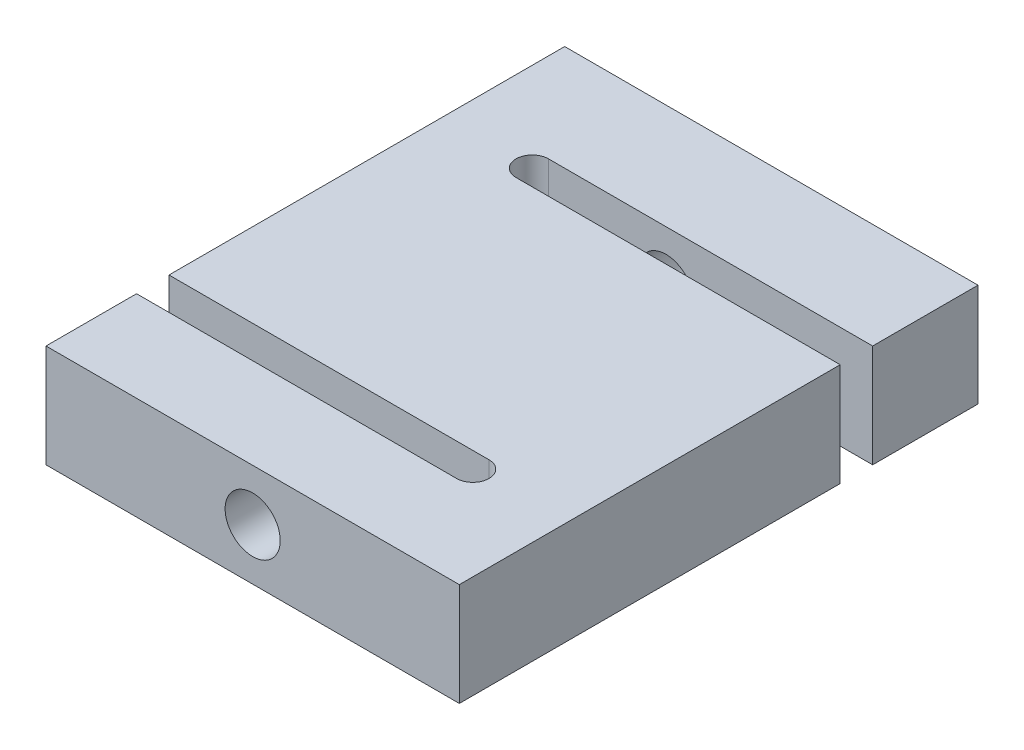
ISO-10303-21;
HEADER;
FILE_DESCRIPTION(('STEP AP214'),'2;1');
FILE_NAME('part.step','',(''),(''),'','','');
FILE_SCHEMA(('AUTOMOTIVE_DESIGN { 1 0 10303 214 1 1 1 1 }'));
ENDSEC;
DATA;
#1=APPLICATION_CONTEXT('core data for automotive mechanical design processes');
#2=APPLICATION_PROTOCOL_DEFINITION('international standard','automotive_design',2000,#1);
#3=PRODUCT_CONTEXT('',#1,'mechanical');
#4=PRODUCT('Part','Part','',(#3));
#5=PRODUCT_RELATED_PRODUCT_CATEGORY('part','',(#4));
#6=PRODUCT_DEFINITION_FORMATION('','',#4);
#7=PRODUCT_DEFINITION_CONTEXT('part definition',#1,'design');
#8=PRODUCT_DEFINITION('design','',#6,#7);
#9=PRODUCT_DEFINITION_SHAPE('','',#8);
#10=(LENGTH_UNIT() NAMED_UNIT(*) SI_UNIT(.MILLI.,.METRE.));
#11=(NAMED_UNIT(*) PLANE_ANGLE_UNIT() SI_UNIT($,.RADIAN.));
#12=(NAMED_UNIT(*) SI_UNIT($,.STERADIAN.) SOLID_ANGLE_UNIT());
#13=UNCERTAINTY_MEASURE_WITH_UNIT(LENGTH_MEASURE(1.E-05),#10,'distance_accuracy_value','');
#14=(GEOMETRIC_REPRESENTATION_CONTEXT(3) GLOBAL_UNCERTAINTY_ASSIGNED_CONTEXT((#13)) GLOBAL_UNIT_ASSIGNED_CONTEXT((#10,
#11,#12)) REPRESENTATION_CONTEXT('',''));
#15=CARTESIAN_POINT('',(0.,0.,0.));
#16=DIRECTION('',(0.,0.,1.));
#17=DIRECTION('',(1.,0.,0.));
#18=AXIS2_PLACEMENT_3D('',#15,#16,#17);
#19=CARTESIAN_POINT('',(-25.5,6.35,32.));
#20=DIRECTION('',(0.,0.,-1.));
#21=DIRECTION('',(-1.,0.,0.));
#22=AXIS2_PLACEMENT_3D('',#19,#20,#21);
#23=PLANE('',#22);
#24=DIRECTION('',(1.,0.,0.));
#25=VECTOR('',#24,1.);
#26=CARTESIAN_POINT('',(-25.5,-6.35,32.));
#27=LINE('',#26,#25);
#28=CARTESIAN_POINT('',(-25.5,-6.35,32.));
#29=VERTEX_POINT('',#28);
#30=CARTESIAN_POINT('',(25.5,-6.35,32.));
#31=VERTEX_POINT('',#30);
#32=EDGE_CURVE('E212',#29,#31,#27,.T.);
#33=ORIENTED_EDGE('',*,*,#32,.T.);
#34=DIRECTION('',(0.,-1.,0.));
#35=VECTOR('',#34,1.);
#36=CARTESIAN_POINT('',(25.5,6.35,32.));
#37=LINE('',#36,#35);
#38=CARTESIAN_POINT('',(25.5,6.35,32.));
#39=VERTEX_POINT('',#38);
#40=EDGE_CURVE('E203',#39,#31,#37,.T.);
#41=ORIENTED_EDGE('',*,*,#40,.F.);
#42=DIRECTION('',(1.,0.,0.));
#43=VECTOR('',#42,1.);
#44=CARTESIAN_POINT('',(-25.5,6.35,32.));
#45=LINE('',#44,#43);
#46=CARTESIAN_POINT('',(-25.5,6.35,32.));
#47=VERTEX_POINT('',#46);
#48=EDGE_CURVE('E201',#47,#39,#45,.T.);
#49=ORIENTED_EDGE('',*,*,#48,.F.);
#50=DIRECTION('',(0.,-1.,0.));
#51=VECTOR('',#50,1.);
#52=CARTESIAN_POINT('',(-25.5,6.35,32.));
#53=LINE('',#52,#51);
#54=EDGE_CURVE('E216',#47,#29,#53,.T.);
#55=ORIENTED_EDGE('',*,*,#54,.T.);
#56=EDGE_LOOP('',(#33,#41,#49,#55));
#57=FACE_BOUND('',#56,.T.);
#58=CARTESIAN_POINT('',(0.,0.,32.));
#59=DIRECTION('',(0.,0.,1.));
#60=DIRECTION('',(1.,0.,0.));
#61=AXIS2_PLACEMENT_3D('',#58,#59,#60);
#62=CIRCLE('',#61,3.39999999999999);
#63=CARTESIAN_POINT('',(3.39999999999999,0.,32.));
#64=VERTEX_POINT('',#63);
#65=EDGE_CURVE('E405',#64,#64,#62,.T.);
#66=ORIENTED_EDGE('',*,*,#65,.F.);
#67=EDGE_LOOP('',(#66));
#68=FACE_BOUND('',#67,.T.);
#69=ADVANCED_FACE('F43',(#57,#68),#23,.F.);
#70=CARTESIAN_POINT('',(-25.5,6.35,-32.));
#71=DIRECTION('',(0.,0.,1.));
#72=DIRECTION('',(1.,0.,0.));
#73=AXIS2_PLACEMENT_3D('',#70,#71,#72);
#74=PLANE('',#73);
#75=DIRECTION('',(-1.,0.,0.));
#76=VECTOR('',#75,1.);
#77=CARTESIAN_POINT('',(-25.5,-6.35,-32.));
#78=LINE('',#77,#76);
#79=CARTESIAN_POINT('',(25.5,-6.35,-32.));
#80=VERTEX_POINT('',#79);
#81=CARTESIAN_POINT('',(-25.5,-6.35,-32.));
#82=VERTEX_POINT('',#81);
#83=EDGE_CURVE('E207',#80,#82,#78,.T.);
#84=ORIENTED_EDGE('',*,*,#83,.T.);
#85=DIRECTION('',(0.,-1.,0.));
#86=VECTOR('',#85,1.);
#87=CARTESIAN_POINT('',(-25.5,6.35,-32.));
#88=LINE('',#87,#86);
#89=CARTESIAN_POINT('',(-25.5,6.35,-32.));
#90=VERTEX_POINT('',#89);
#91=EDGE_CURVE('E219',#90,#82,#88,.T.);
#92=ORIENTED_EDGE('',*,*,#91,.F.);
#93=DIRECTION('',(-1.,0.,0.));
#94=VECTOR('',#93,1.);
#95=CARTESIAN_POINT('',(-25.5,6.35,-32.));
#96=LINE('',#95,#94);
#97=CARTESIAN_POINT('',(25.5,6.35,-32.));
#98=VERTEX_POINT('',#97);
#99=EDGE_CURVE('E194',#98,#90,#96,.T.);
#100=ORIENTED_EDGE('',*,*,#99,.F.);
#101=DIRECTION('',(0.,-1.,0.));
#102=VECTOR('',#101,1.);
#103=CARTESIAN_POINT('',(25.5,6.35,-32.));
#104=LINE('',#103,#102);
#105=EDGE_CURVE('E51',#98,#80,#104,.T.);
#106=ORIENTED_EDGE('',*,*,#105,.T.);
#107=EDGE_LOOP('',(#84,#92,#100,#106));
#108=FACE_BOUND('',#107,.T.);
#109=CARTESIAN_POINT('',(0.,0.,-32.));
#110=DIRECTION('',(0.,0.,-1.));
#111=DIRECTION('',(-1.,0.,0.));
#112=AXIS2_PLACEMENT_3D('',#109,#110,#111);
#113=CIRCLE('',#112,3.39999999999999);
#114=CARTESIAN_POINT('',(-3.39999999999999,0.,-32.));
#115=VERTEX_POINT('',#114);
#116=EDGE_CURVE('E407',#115,#115,#113,.T.);
#117=ORIENTED_EDGE('',*,*,#116,.F.);
#118=EDGE_LOOP('',(#117));
#119=FACE_BOUND('',#118,.T.);
#120=ADVANCED_FACE('F225',(#108,#119),#74,.F.);
#121=CARTESIAN_POINT('',(-25.5,6.35,32.));
#122=DIRECTION('',(1.,0.,0.));
#123=DIRECTION('',(0.,0.,-1.));
#124=AXIS2_PLACEMENT_3D('',#121,#122,#123);
#125=PLANE('',#124);
#126=DIRECTION('',(0.,0.,1.));
#127=VECTOR('',#126,1.);
#128=CARTESIAN_POINT('',(-25.5,-6.35,32.));
#129=LINE('',#128,#127);
#130=CARTESIAN_POINT('',(-25.5,-6.35,16.8250952681111));
#131=VERTEX_POINT('',#130);
#132=EDGE_CURVE('E210',#82,#131,#129,.T.);
#133=ORIENTED_EDGE('',*,*,#132,.T.);
#134=DIRECTION('',(0.,1.,0.));
#135=VECTOR('',#134,1.);
#136=CARTESIAN_POINT('',(-25.5,6.35,16.8250952681111));
#137=LINE('',#136,#135);
#138=CARTESIAN_POINT('',(-25.5,6.35,16.8250952681111));
#139=VERTEX_POINT('',#138);
#140=EDGE_CURVE('E144',#131,#139,#137,.T.);
#141=ORIENTED_EDGE('',*,*,#140,.T.);
#142=DIRECTION('',(0.,0.,1.));
#143=VECTOR('',#142,1.);
#144=CARTESIAN_POINT('',(-25.5,6.35,32.));
#145=LINE('',#144,#143);
#146=EDGE_CURVE('E198',#90,#139,#145,.T.);
#147=ORIENTED_EDGE('',*,*,#146,.F.);
#148=ORIENTED_EDGE('',*,*,#91,.T.);
#149=EDGE_LOOP('',(#133,#141,#147,#148));
#150=FACE_BOUND('',#149,.T.);
#151=ADVANCED_FACE('F234',(#150),#125,.F.);
#152=CARTESIAN_POINT('',(25.5,6.35,32.));
#153=DIRECTION('',(-1.,0.,0.));
#154=DIRECTION('',(0.,0.,1.));
#155=AXIS2_PLACEMENT_3D('',#152,#153,#154);
#156=PLANE('',#155);
#157=DIRECTION('',(0.,0.,-1.));
#158=VECTOR('',#157,1.);
#159=CARTESIAN_POINT('',(25.5,-6.35,32.));
#160=LINE('',#159,#158);
#161=CARTESIAN_POINT('',(25.5,-6.35,-15.));
#162=VERTEX_POINT('',#161);
#163=EDGE_CURVE('E204',#31,#162,#160,.T.);
#164=ORIENTED_EDGE('',*,*,#163,.T.);
#165=DIRECTION('',(0.,1.,0.));
#166=VECTOR('',#165,1.);
#167=CARTESIAN_POINT('',(25.5,-6.35,-15.));
#168=LINE('',#167,#166);
#169=CARTESIAN_POINT('',(25.5,6.35,-15.));
#170=VERTEX_POINT('',#169);
#171=EDGE_CURVE('E182',#162,#170,#168,.T.);
#172=ORIENTED_EDGE('',*,*,#171,.T.);
#173=DIRECTION('',(0.,0.,-1.));
#174=VECTOR('',#173,1.);
#175=CARTESIAN_POINT('',(25.5,6.35,32.));
#176=LINE('',#175,#174);
#177=EDGE_CURVE('E191',#39,#170,#176,.T.);
#178=ORIENTED_EDGE('',*,*,#177,.F.);
#179=ORIENTED_EDGE('',*,*,#40,.T.);
#180=EDGE_LOOP('',(#164,#172,#178,#179));
#181=FACE_BOUND('',#180,.T.);
#182=ADVANCED_FACE('F248',(#181),#156,.F.);
#183=CARTESIAN_POINT('',(25.5,6.35,-19.));
#184=VERTEX_POINT('',#183);
#185=EDGE_CURVE('E195',#184,#98,#176,.T.);
#186=ORIENTED_EDGE('',*,*,#185,.F.);
#187=DIRECTION('',(0.,1.,0.));
#188=VECTOR('',#187,1.);
#189=CARTESIAN_POINT('',(25.5,-6.35,-19.));
#190=LINE('',#189,#188);
#191=CARTESIAN_POINT('',(25.5,-6.35,-19.));
#192=VERTEX_POINT('',#191);
#193=EDGE_CURVE('E175',#192,#184,#190,.T.);
#194=ORIENTED_EDGE('',*,*,#193,.F.);
#195=EDGE_CURVE('E185',#192,#80,#160,.T.);
#196=ORIENTED_EDGE('',*,*,#195,.T.);
#197=ORIENTED_EDGE('',*,*,#105,.F.);
#198=EDGE_LOOP('',(#186,#194,#196,#197));
#199=FACE_BOUND('',#198,.T.);
#200=ADVANCED_FACE('F45',(#199),#156,.F.);
#201=CARTESIAN_POINT('',(-25.5,6.35,20.8250952681111));
#202=VERTEX_POINT('',#201);
#203=EDGE_CURVE('E197',#202,#47,#145,.T.);
#204=ORIENTED_EDGE('',*,*,#203,.F.);
#205=DIRECTION('',(0.,-1.,0.));
#206=VECTOR('',#205,1.);
#207=CARTESIAN_POINT('',(-25.5,6.35,20.8250952681111));
#208=LINE('',#207,#206);
#209=CARTESIAN_POINT('',(-25.5,-6.35,20.8250952681111));
#210=VERTEX_POINT('',#209);
#211=EDGE_CURVE('E137',#202,#210,#208,.T.);
#212=ORIENTED_EDGE('',*,*,#211,.T.);
#213=EDGE_CURVE('E209',#210,#29,#129,.T.);
#214=ORIENTED_EDGE('',*,*,#213,.T.);
#215=ORIENTED_EDGE('',*,*,#54,.F.);
#216=EDGE_LOOP('',(#204,#212,#214,#215));
#217=FACE_BOUND('',#216,.T.);
#218=ADVANCED_FACE('F257',(#217),#125,.F.);
#219=CARTESIAN_POINT('',(0.,6.35,0.));
#220=DIRECTION('',(0.,-1.,0.));
#221=DIRECTION('',(0.,0.,-1.));
#222=AXIS2_PLACEMENT_3D('',#219,#220,#221);
#223=PLANE('',#222);
#224=ORIENTED_EDGE('',*,*,#146,.T.);
#225=DIRECTION('',(-1.,0.,0.));
#226=VECTOR('',#225,1.);
#227=CARTESIAN_POINT('',(-26.0058954879258,6.35,16.8250952681111));
#228=LINE('',#227,#226);
#229=CARTESIAN_POINT('',(13.9941045120742,6.35,16.8250952681111));
#230=VERTEX_POINT('',#229);
#231=EDGE_CURVE('E152',#230,#139,#228,.T.);
#232=ORIENTED_EDGE('',*,*,#231,.F.);
#233=CARTESIAN_POINT('',(13.9941045120742,6.35,18.8250952681111));
#234=DIRECTION('',(0.,1.,0.));
#235=DIRECTION('',(0.,0.,-1.));
#236=AXIS2_PLACEMENT_3D('',#233,#234,#235);
#237=CIRCLE('',#236,2.);
#238=CARTESIAN_POINT('',(13.9941045120742,6.35,20.8250952681111));
#239=VERTEX_POINT('',#238);
#240=EDGE_CURVE('E134',#239,#230,#237,.T.);
#241=ORIENTED_EDGE('',*,*,#240,.F.);
#242=DIRECTION('',(1.,0.,0.));
#243=VECTOR('',#242,1.);
#244=CARTESIAN_POINT('',(-26.0058954879258,6.35,20.8250952681111));
#245=LINE('',#244,#243);
#246=EDGE_CURVE('E159',#202,#239,#245,.T.);
#247=ORIENTED_EDGE('',*,*,#246,.F.);
#248=ORIENTED_EDGE('',*,*,#203,.T.);
#249=ORIENTED_EDGE('',*,*,#48,.T.);
#250=ORIENTED_EDGE('',*,*,#177,.T.);
#251=DIRECTION('',(1.,0.,0.));
#252=VECTOR('',#251,1.);
#253=CARTESIAN_POINT('',(25.5,6.35,-15.));
#254=LINE('',#253,#252);
#255=CARTESIAN_POINT('',(-14.5,6.35,-15.));
#256=VERTEX_POINT('',#255);
#257=EDGE_CURVE('E170',#256,#170,#254,.T.);
#258=ORIENTED_EDGE('',*,*,#257,.F.);
#259=CARTESIAN_POINT('',(-14.5,6.35,-17.));
#260=DIRECTION('',(0.,1.,0.));
#261=DIRECTION('',(0.,0.,1.));
#262=AXIS2_PLACEMENT_3D('',#259,#260,#261);
#263=CIRCLE('',#262,2.);
#264=CARTESIAN_POINT('',(-14.5,6.35,-19.));
#265=VERTEX_POINT('',#264);
#266=EDGE_CURVE('E178',#265,#256,#263,.T.);
#267=ORIENTED_EDGE('',*,*,#266,.F.);
#268=DIRECTION('',(-1.,0.,0.));
#269=VECTOR('',#268,1.);
#270=CARTESIAN_POINT('',(25.5,6.35,-19.));
#271=LINE('',#270,#269);
#272=EDGE_CURVE('E166',#184,#265,#271,.T.);
#273=ORIENTED_EDGE('',*,*,#272,.F.);
#274=ORIENTED_EDGE('',*,*,#185,.T.);
#275=ORIENTED_EDGE('',*,*,#99,.T.);
#276=EDGE_LOOP('',(#224,#232,#241,#247,#248,#249,#250,#258,#267,#273,#274,#275));
#277=FACE_BOUND('',#276,.T.);
#278=ADVANCED_FACE('F237',(#277),#223,.F.);
#279=CARTESIAN_POINT('',(0.,-6.35,0.));
#280=DIRECTION('',(0.,-1.,0.));
#281=DIRECTION('',(0.,0.,-1.));
#282=AXIS2_PLACEMENT_3D('',#279,#280,#281);
#283=PLANE('',#282);
#284=DIRECTION('',(-1.,0.,0.));
#285=VECTOR('',#284,1.);
#286=CARTESIAN_POINT('',(-26.0058954879258,-6.35,16.8250952681111));
#287=LINE('',#286,#285);
#288=CARTESIAN_POINT('',(13.9941045120742,-6.35,16.8250952681111));
#289=VERTEX_POINT('',#288);
#290=EDGE_CURVE('E141',#289,#131,#287,.T.);
#291=ORIENTED_EDGE('',*,*,#290,.T.);
#292=ORIENTED_EDGE('',*,*,#132,.F.);
#293=ORIENTED_EDGE('',*,*,#83,.F.);
#294=ORIENTED_EDGE('',*,*,#195,.F.);
#295=DIRECTION('',(-1.,0.,0.));
#296=VECTOR('',#295,1.);
#297=CARTESIAN_POINT('',(25.5,-6.35,-19.));
#298=LINE('',#297,#296);
#299=CARTESIAN_POINT('',(-14.5,-6.35,-19.));
#300=VERTEX_POINT('',#299);
#301=EDGE_CURVE('E167',#192,#300,#298,.T.);
#302=ORIENTED_EDGE('',*,*,#301,.T.);
#303=CARTESIAN_POINT('',(-14.5,-6.35,-17.));
#304=DIRECTION('',(0.,1.,0.));
#305=DIRECTION('',(0.,0.,1.));
#306=AXIS2_PLACEMENT_3D('',#303,#304,#305);
#307=CIRCLE('',#306,2.);
#308=CARTESIAN_POINT('',(-14.5,-6.35,-15.));
#309=VERTEX_POINT('',#308);
#310=EDGE_CURVE('E66',#300,#309,#307,.T.);
#311=ORIENTED_EDGE('',*,*,#310,.T.);
#312=DIRECTION('',(1.,0.,0.));
#313=VECTOR('',#312,1.);
#314=CARTESIAN_POINT('',(25.5,-6.35,-15.));
#315=LINE('',#314,#313);
#316=EDGE_CURVE('E172',#309,#162,#315,.T.);
#317=ORIENTED_EDGE('',*,*,#316,.T.);
#318=ORIENTED_EDGE('',*,*,#163,.F.);
#319=ORIENTED_EDGE('',*,*,#32,.F.);
#320=ORIENTED_EDGE('',*,*,#213,.F.);
#321=DIRECTION('',(-1.,0.,0.));
#322=VECTOR('',#321,1.);
#323=CARTESIAN_POINT('',(0.,-6.35,20.8250952681111));
#324=LINE('',#323,#322);
#325=CARTESIAN_POINT('',(13.9941045120742,-6.35,20.8250952681111));
#326=VERTEX_POINT('',#325);
#327=EDGE_CURVE('E11',#326,#210,#324,.T.);
#328=ORIENTED_EDGE('',*,*,#327,.F.);
#329=CARTESIAN_POINT('',(13.9941045120742,-6.35,18.8250952681111));
#330=DIRECTION('',(0.,1.,0.));
#331=DIRECTION('',(0.,0.,-1.));
#332=AXIS2_PLACEMENT_3D('',#329,#330,#331);
#333=CIRCLE('',#332,2.);
#334=EDGE_CURVE('E58',#326,#289,#333,.T.);
#335=ORIENTED_EDGE('',*,*,#334,.T.);
#336=EDGE_LOOP('',(#291,#292,#293,#294,#302,#311,#317,#318,#319,#320,#328,#335));
#337=FACE_BOUND('',#336,.T.);
#338=ADVANCED_FACE('F150',(#337),#283,.T.);
#339=CARTESIAN_POINT('',(25.5,-6.35,-15.));
#340=DIRECTION('',(0.,0.,1.));
#341=DIRECTION('',(1.,0.,0.));
#342=AXIS2_PLACEMENT_3D('',#339,#340,#341);
#343=PLANE('',#342);
#344=ORIENTED_EDGE('',*,*,#257,.T.);
#345=ORIENTED_EDGE('',*,*,#171,.F.);
#346=ORIENTED_EDGE('',*,*,#316,.F.);
#347=DIRECTION('',(0.,1.,0.));
#348=VECTOR('',#347,1.);
#349=CARTESIAN_POINT('',(-14.5,-6.35,-15.));
#350=LINE('',#349,#348);
#351=EDGE_CURVE('E186',#309,#256,#350,.T.);
#352=ORIENTED_EDGE('',*,*,#351,.T.);
#353=EDGE_LOOP('',(#344,#345,#346,#352));
#354=FACE_BOUND('',#353,.T.);
#355=ADVANCED_FACE('F261',(#354),#343,.F.);
#356=CARTESIAN_POINT('',(-14.5,-6.35,-17.));
#357=DIRECTION('',(0.,1.,0.));
#358=DIRECTION('',(0.,0.,1.));
#359=AXIS2_PLACEMENT_3D('',#356,#357,#358);
#360=CYLINDRICAL_SURFACE('',#359,2.);
#361=ORIENTED_EDGE('',*,*,#266,.T.);
#362=ORIENTED_EDGE('',*,*,#351,.F.);
#363=ORIENTED_EDGE('',*,*,#310,.F.);
#364=DIRECTION('',(0.,1.,0.));
#365=VECTOR('',#364,1.);
#366=CARTESIAN_POINT('',(-14.5,-6.35,-19.));
#367=LINE('',#366,#365);
#368=EDGE_CURVE('E188',#300,#265,#367,.T.);
#369=ORIENTED_EDGE('',*,*,#368,.T.);
#370=EDGE_LOOP('',(#361,#362,#363,#369));
#371=FACE_BOUND('',#370,.T.);
#372=ADVANCED_FACE('F262',(#371),#360,.F.);
#373=CARTESIAN_POINT('',(25.5,-6.35,-19.));
#374=DIRECTION('',(0.,0.,-1.));
#375=DIRECTION('',(-1.,0.,0.));
#376=AXIS2_PLACEMENT_3D('',#373,#374,#375);
#377=PLANE('',#376);
#378=CARTESIAN_POINT('',(0.,0.,-19.));
#379=DIRECTION('',(0.,0.,-1.));
#380=DIRECTION('',(-1.,0.,0.));
#381=AXIS2_PLACEMENT_3D('',#378,#379,#380);
#382=CIRCLE('',#381,3.39999999999999);
#383=CARTESIAN_POINT('',(-3.39999999999999,0.,-19.));
#384=VERTEX_POINT('',#383);
#385=EDGE_CURVE('E156',#384,#384,#382,.T.);
#386=ORIENTED_EDGE('',*,*,#385,.T.);
#387=EDGE_LOOP('',(#386));
#388=FACE_BOUND('',#387,.T.);
#389=ORIENTED_EDGE('',*,*,#272,.T.);
#390=ORIENTED_EDGE('',*,*,#368,.F.);
#391=ORIENTED_EDGE('',*,*,#301,.F.);
#392=ORIENTED_EDGE('',*,*,#193,.T.);
#393=EDGE_LOOP('',(#389,#390,#391,#392));
#394=FACE_BOUND('',#393,.T.);
#395=ADVANCED_FACE('F242',(#388,#394),#377,.F.);
#396=CARTESIAN_POINT('',(-26.0058954879258,-6.35,16.8250952681111));
#397=DIRECTION('',(0.,0.,-1.));
#398=DIRECTION('',(-1.,0.,0.));
#399=AXIS2_PLACEMENT_3D('',#396,#397,#398);
#400=PLANE('',#399);
#401=ORIENTED_EDGE('',*,*,#290,.F.);
#402=DIRECTION('',(0.,1.,0.));
#403=VECTOR('',#402,1.);
#404=CARTESIAN_POINT('',(13.9941045120742,-6.35,16.8250952681111));
#405=LINE('',#404,#403);
#406=EDGE_CURVE('E130',#289,#230,#405,.T.);
#407=ORIENTED_EDGE('',*,*,#406,.T.);
#408=ORIENTED_EDGE('',*,*,#231,.T.);
#409=ORIENTED_EDGE('',*,*,#140,.F.);
#410=EDGE_LOOP('',(#401,#407,#408,#409));
#411=FACE_BOUND('',#410,.T.);
#412=ADVANCED_FACE('F142',(#411),#400,.F.);
#413=CARTESIAN_POINT('',(-26.0058954879258,-6.35,20.8250952681111));
#414=DIRECTION('',(0.,0.,1.));
#415=DIRECTION('',(1.,0.,0.));
#416=AXIS2_PLACEMENT_3D('',#413,#414,#415);
#417=PLANE('',#416);
#418=CARTESIAN_POINT('',(0.,0.,20.8250952681111));
#419=DIRECTION('',(0.,0.,1.));
#420=DIRECTION('',(1.,0.,0.));
#421=AXIS2_PLACEMENT_3D('',#418,#419,#420);
#422=CIRCLE('',#421,3.39999999999999);
#423=CARTESIAN_POINT('',(3.39999999999999,0.,20.8250952681111));
#424=VERTEX_POINT('',#423);
#425=EDGE_CURVE('E402',#424,#424,#422,.T.);
#426=ORIENTED_EDGE('',*,*,#425,.T.);
#427=EDGE_LOOP('',(#426));
#428=FACE_BOUND('',#427,.T.);
#429=ORIENTED_EDGE('',*,*,#246,.T.);
#430=DIRECTION('',(0.,1.,0.));
#431=VECTOR('',#430,1.);
#432=CARTESIAN_POINT('',(13.9941045120742,-6.35,20.8250952681111));
#433=LINE('',#432,#431);
#434=EDGE_CURVE('E138',#326,#239,#433,.T.);
#435=ORIENTED_EDGE('',*,*,#434,.F.);
#436=ORIENTED_EDGE('',*,*,#327,.T.);
#437=ORIENTED_EDGE('',*,*,#211,.F.);
#438=EDGE_LOOP('',(#429,#435,#436,#437));
#439=FACE_BOUND('',#438,.T.);
#440=ADVANCED_FACE('F260',(#428,#439),#417,.F.);
#441=CARTESIAN_POINT('',(13.9941045120742,-6.35,18.8250952681111));
#442=DIRECTION('',(0.,1.,0.));
#443=DIRECTION('',(0.,0.,1.));
#444=AXIS2_PLACEMENT_3D('',#441,#442,#443);
#445=CYLINDRICAL_SURFACE('',#444,2.);
#446=ORIENTED_EDGE('',*,*,#240,.T.);
#447=ORIENTED_EDGE('',*,*,#406,.F.);
#448=ORIENTED_EDGE('',*,*,#334,.F.);
#449=ORIENTED_EDGE('',*,*,#434,.T.);
#450=EDGE_LOOP('',(#446,#447,#448,#449));
#451=FACE_BOUND('',#450,.T.);
#452=ADVANCED_FACE('F132',(#451),#445,.F.);
#453=CARTESIAN_POINT('',(0.,0.,-32.));
#454=DIRECTION('',(0.,0.,-1.));
#455=DIRECTION('',(-1.,0.,0.));
#456=AXIS2_PLACEMENT_3D('',#453,#454,#455);
#457=CYLINDRICAL_SURFACE('',#456,3.39999999999999);
#458=ORIENTED_EDGE('',*,*,#385,.F.);
#459=EDGE_LOOP('',(#458));
#460=FACE_BOUND('',#459,.T.);
#461=ORIENTED_EDGE('',*,*,#116,.T.);
#462=EDGE_LOOP('',(#461));
#463=FACE_BOUND('',#462,.T.);
#464=ADVANCED_FACE('F348',(#460,#463),#457,.F.);
#465=CARTESIAN_POINT('',(0.,0.,32.));
#466=DIRECTION('',(0.,0.,1.));
#467=DIRECTION('',(1.,0.,0.));
#468=AXIS2_PLACEMENT_3D('',#465,#466,#467);
#469=CYLINDRICAL_SURFACE('',#468,3.39999999999999);
#470=ORIENTED_EDGE('',*,*,#425,.F.);
#471=EDGE_LOOP('',(#470));
#472=FACE_BOUND('',#471,.T.);
#473=ORIENTED_EDGE('',*,*,#65,.T.);
#474=EDGE_LOOP('',(#473));
#475=FACE_BOUND('',#474,.T.);
#476=ADVANCED_FACE('F362',(#472,#475),#469,.F.);
#477=CLOSED_SHELL('',(#69,#120,#151,#182,#200,#218,#278,#338,#355,#372,#395,#412,#440,#452,#464,#476));
#478=MANIFOLD_SOLID_BREP('B2',#477);
#479=ADVANCED_BREP_SHAPE_REPRESENTATION('',(#18,#478),#14);
#480=SHAPE_DEFINITION_REPRESENTATION(#9,#479);
ENDSEC;
END-ISO-10303-21;
